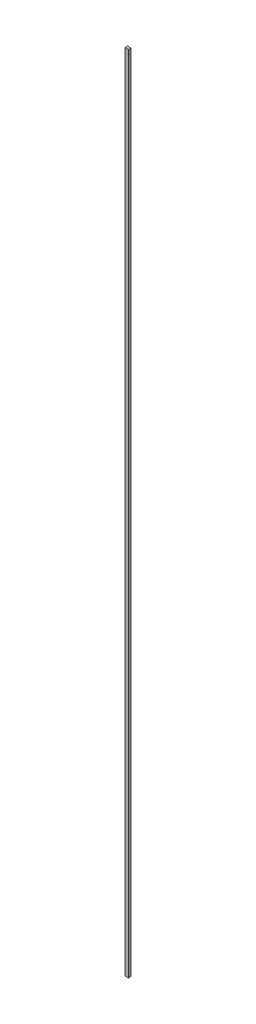
ISO-10303-21;
HEADER;
FILE_DESCRIPTION(('STEP AP214'),'2;1');
FILE_NAME('part.step','',(''),(''),'','','');
FILE_SCHEMA(('AUTOMOTIVE_DESIGN { 1 0 10303 214 1 1 1 1 }'));
ENDSEC;
DATA;
#1=APPLICATION_CONTEXT('core data for automotive mechanical design processes');
#2=APPLICATION_PROTOCOL_DEFINITION('international standard','automotive_design',2000,#1);
#3=PRODUCT_CONTEXT('',#1,'mechanical');
#4=PRODUCT('Part','Part','',(#3));
#5=PRODUCT_RELATED_PRODUCT_CATEGORY('part','',(#4));
#6=PRODUCT_DEFINITION_FORMATION('','',#4);
#7=PRODUCT_DEFINITION_CONTEXT('part definition',#1,'design');
#8=PRODUCT_DEFINITION('design','',#6,#7);
#9=PRODUCT_DEFINITION_SHAPE('','',#8);
#10=(LENGTH_UNIT() NAMED_UNIT(*) SI_UNIT(.MILLI.,.METRE.));
#11=(NAMED_UNIT(*) PLANE_ANGLE_UNIT() SI_UNIT($,.RADIAN.));
#12=(NAMED_UNIT(*) SI_UNIT($,.STERADIAN.) SOLID_ANGLE_UNIT());
#13=UNCERTAINTY_MEASURE_WITH_UNIT(LENGTH_MEASURE(1.E-05),#10,'distance_accuracy_value','');
#14=(GEOMETRIC_REPRESENTATION_CONTEXT(3) GLOBAL_UNCERTAINTY_ASSIGNED_CONTEXT((#13)) GLOBAL_UNIT_ASSIGNED_CONTEXT((#10,
#11,#12)) REPRESENTATION_CONTEXT('',''));
#15=CARTESIAN_POINT('',(0.,0.,0.));
#16=DIRECTION('',(0.,0.,1.));
#17=DIRECTION('',(1.,0.,0.));
#18=AXIS2_PLACEMENT_3D('',#15,#16,#17);
#19=CARTESIAN_POINT('',(3.17500000000004,-736.6,2.38125));
#20=DIRECTION('',(1.,0.,0.));
#21=DIRECTION('',(0.,0.,-1.));
#22=AXIS2_PLACEMENT_3D('',#19,#20,#21);
#23=PLANE('',#22);
#24=DIRECTION('',(0.,1.,0.));
#25=VECTOR('',#24,1.);
#26=CARTESIAN_POINT('',(3.17500000000004,-736.6,-2.38125));
#27=LINE('',#26,#25);
#28=CARTESIAN_POINT('',(3.17500000000004,-736.6,-2.38125));
#29=VERTEX_POINT('',#28);
#30=CARTESIAN_POINT('',(3.17500000000004,736.6,-2.38125));
#31=VERTEX_POINT('',#30);
#32=EDGE_CURVE('E36',#29,#31,#27,.T.);
#33=ORIENTED_EDGE('',*,*,#32,.T.);
#34=DIRECTION('',(0.,0.,-1.));
#35=VECTOR('',#34,1.);
#36=CARTESIAN_POINT('',(3.17500000000004,736.6,2.38125));
#37=LINE('',#36,#35);
#38=CARTESIAN_POINT('',(3.17500000000004,736.6,2.38125));
#39=VERTEX_POINT('',#38);
#40=EDGE_CURVE('E73',#39,#31,#37,.T.);
#41=ORIENTED_EDGE('',*,*,#40,.F.);
#42=DIRECTION('',(0.,1.,0.));
#43=VECTOR('',#42,1.);
#44=CARTESIAN_POINT('',(3.17500000000004,-736.6,2.38125));
#45=LINE('',#44,#43);
#46=CARTESIAN_POINT('',(3.17500000000004,-736.6,2.38125));
#47=VERTEX_POINT('',#46);
#48=EDGE_CURVE('E11',#47,#39,#45,.T.);
#49=ORIENTED_EDGE('',*,*,#48,.F.);
#50=DIRECTION('',(0.,0.,-1.));
#51=VECTOR('',#50,1.);
#52=CARTESIAN_POINT('',(3.17500000000004,-736.6,2.38125));
#53=LINE('',#52,#51);
#54=EDGE_CURVE('E74',#47,#29,#53,.T.);
#55=ORIENTED_EDGE('',*,*,#54,.T.);
#56=EDGE_LOOP('',(#33,#41,#49,#55));
#57=FACE_BOUND('',#56,.T.);
#58=ADVANCED_FACE('F33',(#57),#23,.T.);
#59=CARTESIAN_POINT('',(-3.17499999999993,-736.6,2.38125));
#60=DIRECTION('',(0.,0.,1.));
#61=DIRECTION('',(1.,0.,0.));
#62=AXIS2_PLACEMENT_3D('',#59,#60,#61);
#63=PLANE('',#62);
#64=ORIENTED_EDGE('',*,*,#48,.T.);
#65=DIRECTION('',(1.,0.,0.));
#66=VECTOR('',#65,1.);
#67=CARTESIAN_POINT('',(-3.17499999999993,736.6,2.38125));
#68=LINE('',#67,#66);
#69=CARTESIAN_POINT('',(-3.17499999999993,736.6,2.38125));
#70=VERTEX_POINT('',#69);
#71=EDGE_CURVE('E90',#70,#39,#68,.T.);
#72=ORIENTED_EDGE('',*,*,#71,.F.);
#73=DIRECTION('',(0.,1.,0.));
#74=VECTOR('',#73,1.);
#75=CARTESIAN_POINT('',(-3.17499999999993,-736.6,2.38125));
#76=LINE('',#75,#74);
#77=CARTESIAN_POINT('',(-3.17499999999993,-736.6,2.38125));
#78=VERTEX_POINT('',#77);
#79=EDGE_CURVE('E41',#78,#70,#76,.T.);
#80=ORIENTED_EDGE('',*,*,#79,.F.);
#81=DIRECTION('',(1.,0.,0.));
#82=VECTOR('',#81,1.);
#83=CARTESIAN_POINT('',(-3.17499999999993,-736.6,2.38125));
#84=LINE('',#83,#82);
#85=EDGE_CURVE('E79',#78,#47,#84,.T.);
#86=ORIENTED_EDGE('',*,*,#85,.T.);
#87=EDGE_LOOP('',(#64,#72,#80,#86));
#88=FACE_BOUND('',#87,.T.);
#89=ADVANCED_FACE('F105',(#88),#63,.T.);
#90=CARTESIAN_POINT('',(-3.17499999999993,-736.6,2.38125));
#91=DIRECTION('',(-1.,0.,0.));
#92=DIRECTION('',(0.,0.,1.));
#93=AXIS2_PLACEMENT_3D('',#90,#91,#92);
#94=PLANE('',#93);
#95=ORIENTED_EDGE('',*,*,#79,.T.);
#96=DIRECTION('',(0.,0.,1.));
#97=VECTOR('',#96,1.);
#98=CARTESIAN_POINT('',(-3.17499999999993,736.6,2.38125));
#99=LINE('',#98,#97);
#100=CARTESIAN_POINT('',(-3.17499999999993,736.6,-2.38125));
#101=VERTEX_POINT('',#100);
#102=EDGE_CURVE('E86',#101,#70,#99,.T.);
#103=ORIENTED_EDGE('',*,*,#102,.F.);
#104=DIRECTION('',(0.,1.,0.));
#105=VECTOR('',#104,1.);
#106=CARTESIAN_POINT('',(-3.17499999999993,-736.6,-2.38125));
#107=LINE('',#106,#105);
#108=CARTESIAN_POINT('',(-3.17499999999993,-736.6,-2.38125));
#109=VERTEX_POINT('',#108);
#110=EDGE_CURVE('E78',#109,#101,#107,.T.);
#111=ORIENTED_EDGE('',*,*,#110,.F.);
#112=DIRECTION('',(0.,0.,1.));
#113=VECTOR('',#112,1.);
#114=CARTESIAN_POINT('',(-3.17499999999993,-736.6,2.38125));
#115=LINE('',#114,#113);
#116=EDGE_CURVE('E98',#109,#78,#115,.T.);
#117=ORIENTED_EDGE('',*,*,#116,.T.);
#118=EDGE_LOOP('',(#95,#103,#111,#117));
#119=FACE_BOUND('',#118,.T.);
#120=ADVANCED_FACE('F102',(#119),#94,.T.);
#121=CARTESIAN_POINT('',(-3.17499999999993,-736.6,-2.38125));
#122=DIRECTION('',(0.,0.,-1.));
#123=DIRECTION('',(-1.,0.,0.));
#124=AXIS2_PLACEMENT_3D('',#121,#122,#123);
#125=PLANE('',#124);
#126=ORIENTED_EDGE('',*,*,#110,.T.);
#127=DIRECTION('',(-1.,0.,0.));
#128=VECTOR('',#127,1.);
#129=CARTESIAN_POINT('',(-3.17499999999993,736.6,-2.38125));
#130=LINE('',#129,#128);
#131=EDGE_CURVE('E81',#31,#101,#130,.T.);
#132=ORIENTED_EDGE('',*,*,#131,.F.);
#133=ORIENTED_EDGE('',*,*,#32,.F.);
#134=DIRECTION('',(-1.,0.,0.));
#135=VECTOR('',#134,1.);
#136=CARTESIAN_POINT('',(-3.17499999999993,-736.6,-2.38125));
#137=LINE('',#136,#135);
#138=EDGE_CURVE('E96',#29,#109,#137,.T.);
#139=ORIENTED_EDGE('',*,*,#138,.T.);
#140=EDGE_LOOP('',(#126,#132,#133,#139));
#141=FACE_BOUND('',#140,.T.);
#142=ADVANCED_FACE('F82',(#141),#125,.T.);
#143=CARTESIAN_POINT('',(0.,-736.6,0.));
#144=DIRECTION('',(0.,-1.,0.));
#145=DIRECTION('',(0.,0.,-1.));
#146=AXIS2_PLACEMENT_3D('',#143,#144,#145);
#147=PLANE('',#146);
#148=ORIENTED_EDGE('',*,*,#54,.F.);
#149=ORIENTED_EDGE('',*,*,#85,.F.);
#150=ORIENTED_EDGE('',*,*,#116,.F.);
#151=ORIENTED_EDGE('',*,*,#138,.F.);
#152=EDGE_LOOP('',(#148,#149,#150,#151));
#153=FACE_BOUND('',#152,.T.);
#154=ADVANCED_FACE('F107',(#153),#147,.T.);
#155=CARTESIAN_POINT('',(0.,736.6,0.));
#156=DIRECTION('',(0.,-1.,0.));
#157=DIRECTION('',(0.,0.,-1.));
#158=AXIS2_PLACEMENT_3D('',#155,#156,#157);
#159=PLANE('',#158);
#160=ORIENTED_EDGE('',*,*,#40,.T.);
#161=ORIENTED_EDGE('',*,*,#131,.T.);
#162=ORIENTED_EDGE('',*,*,#102,.T.);
#163=ORIENTED_EDGE('',*,*,#71,.T.);
#164=EDGE_LOOP('',(#160,#161,#162,#163));
#165=FACE_BOUND('',#164,.T.);
#166=ADVANCED_FACE('F89',(#165),#159,.F.);
#167=CLOSED_SHELL('',(#58,#89,#120,#142,#154,#166));
#168=MANIFOLD_SOLID_BREP('B2',#167);
#169=ADVANCED_BREP_SHAPE_REPRESENTATION('',(#18,#168),#14);
#170=SHAPE_DEFINITION_REPRESENTATION(#9,#169);
ENDSEC;
END-ISO-10303-21;
